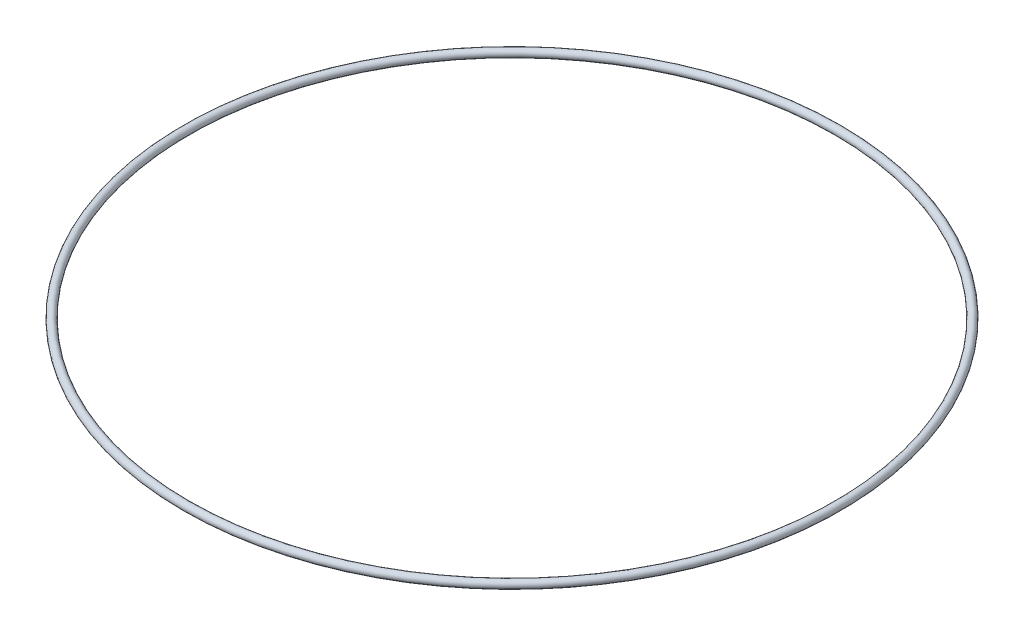
ISO-10303-21;
HEADER;
FILE_DESCRIPTION(('STEP AP214'),'2;1');
FILE_NAME('part.step','',(''),(''),'','','');
FILE_SCHEMA(('AUTOMOTIVE_DESIGN { 1 0 10303 214 1 1 1 1 }'));
ENDSEC;
DATA;
#1=APPLICATION_CONTEXT('core data for automotive mechanical design processes');
#2=APPLICATION_PROTOCOL_DEFINITION('international standard','automotive_design',2000,#1);
#3=PRODUCT_CONTEXT('',#1,'mechanical');
#4=PRODUCT('Part','Part','',(#3));
#5=PRODUCT_RELATED_PRODUCT_CATEGORY('part','',(#4));
#6=PRODUCT_DEFINITION_FORMATION('','',#4);
#7=PRODUCT_DEFINITION_CONTEXT('part definition',#1,'design');
#8=PRODUCT_DEFINITION('design','',#6,#7);
#9=PRODUCT_DEFINITION_SHAPE('','',#8);
#10=(LENGTH_UNIT() NAMED_UNIT(*) SI_UNIT(.MILLI.,.METRE.));
#11=(NAMED_UNIT(*) PLANE_ANGLE_UNIT() SI_UNIT($,.RADIAN.));
#12=(NAMED_UNIT(*) SI_UNIT($,.STERADIAN.) SOLID_ANGLE_UNIT());
#13=UNCERTAINTY_MEASURE_WITH_UNIT(LENGTH_MEASURE(1.E-05),#10,'distance_accuracy_value','');
#14=(GEOMETRIC_REPRESENTATION_CONTEXT(3) GLOBAL_UNCERTAINTY_ASSIGNED_CONTEXT((#13)) GLOBAL_UNIT_ASSIGNED_CONTEXT((#10,
#11,#12)) REPRESENTATION_CONTEXT('',''));
#15=CARTESIAN_POINT('',(0.,0.,0.));
#16=DIRECTION('',(0.,0.,1.));
#17=DIRECTION('',(1.,0.,0.));
#18=AXIS2_PLACEMENT_3D('',#15,#16,#17);
#19=CARTESIAN_POINT('',(0.,0.,0.));
#20=DIRECTION('',(0.,-1.,0.));
#21=DIRECTION('',(0.,0.,-1.));
#22=AXIS2_PLACEMENT_3D('',#19,#20,#21);
#23=TOROIDAL_SURFACE('',#22,205.,2.5);
#24=CARTESIAN_POINT('',(0.,0.,-207.5));
#25=VERTEX_POINT('',#24);
#26=VERTEX_LOOP('',#25);
#27=FACE_BOUND('',#26,.T.);
#28=ADVANCED_FACE('F29',(#27),#23,.T.);
#29=CLOSED_SHELL('',(#28));
#30=MANIFOLD_SOLID_BREP('B2',#29);
#31=ADVANCED_BREP_SHAPE_REPRESENTATION('',(#18,#30),#14);
#32=SHAPE_DEFINITION_REPRESENTATION(#9,#31);
ENDSEC;
END-ISO-10303-21;
